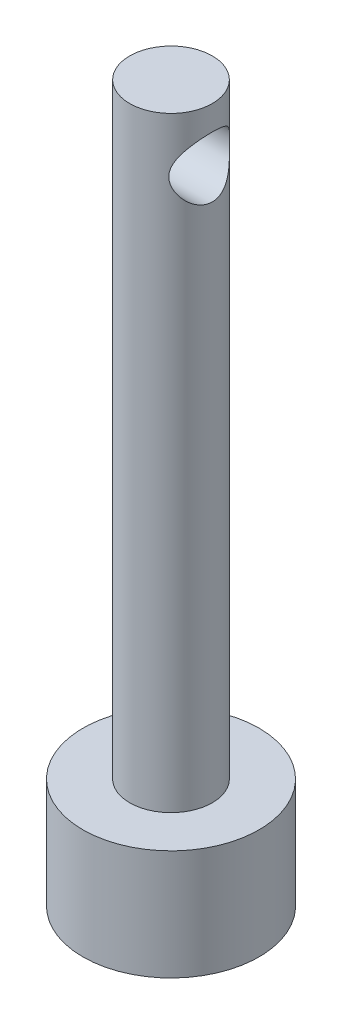
ISO-10303-21;
HEADER;
FILE_DESCRIPTION(('STEP AP214'),'2;1');
FILE_NAME('part.step','',(''),(''),'','','');
FILE_SCHEMA(('AUTOMOTIVE_DESIGN { 1 0 10303 214 1 1 1 1 }'));
ENDSEC;
DATA;
#1=APPLICATION_CONTEXT('core data for automotive mechanical design processes');
#2=APPLICATION_PROTOCOL_DEFINITION('international standard','automotive_design',2000,#1);
#3=PRODUCT_CONTEXT('',#1,'mechanical');
#4=PRODUCT('Part','Part','',(#3));
#5=PRODUCT_RELATED_PRODUCT_CATEGORY('part','',(#4));
#6=PRODUCT_DEFINITION_FORMATION('','',#4);
#7=PRODUCT_DEFINITION_CONTEXT('part definition',#1,'design');
#8=PRODUCT_DEFINITION('design','',#6,#7);
#9=PRODUCT_DEFINITION_SHAPE('','',#8);
#10=(LENGTH_UNIT() NAMED_UNIT(*) SI_UNIT(.MILLI.,.METRE.));
#11=(NAMED_UNIT(*) PLANE_ANGLE_UNIT() SI_UNIT($,.RADIAN.));
#12=(NAMED_UNIT(*) SI_UNIT($,.STERADIAN.) SOLID_ANGLE_UNIT());
#13=UNCERTAINTY_MEASURE_WITH_UNIT(LENGTH_MEASURE(1.E-05),#10,'distance_accuracy_value','');
#14=(GEOMETRIC_REPRESENTATION_CONTEXT(3) GLOBAL_UNCERTAINTY_ASSIGNED_CONTEXT((#13)) GLOBAL_UNIT_ASSIGNED_CONTEXT((#10,
#11,#12)) REPRESENTATION_CONTEXT('',''));
#15=CARTESIAN_POINT('',(0.,0.,0.));
#16=DIRECTION('',(0.,0.,1.));
#17=DIRECTION('',(1.,0.,0.));
#18=AXIS2_PLACEMENT_3D('',#15,#16,#17);
#19=CARTESIAN_POINT('',(0.,2.,0.));
#20=DIRECTION('',(0.,-1.,0.));
#21=DIRECTION('',(0.,0.,-1.));
#22=AXIS2_PLACEMENT_3D('',#19,#20,#21);
#23=CYLINDRICAL_SURFACE('',#22,1.6);
#24=CARTESIAN_POINT('',(0.,2.,0.));
#25=DIRECTION('',(0.,1.,0.));
#26=DIRECTION('',(0.,0.,1.));
#27=AXIS2_PLACEMENT_3D('',#24,#25,#26);
#28=CIRCLE('',#27,1.6);
#29=CARTESIAN_POINT('',(0.,2.,1.6));
#30=VERTEX_POINT('',#29);
#31=EDGE_CURVE('E54',#30,#30,#28,.T.);
#32=ORIENTED_EDGE('',*,*,#31,.F.);
#33=EDGE_LOOP('',(#32));
#34=FACE_BOUND('',#33,.T.);
#35=CARTESIAN_POINT('',(0.,0.,0.));
#36=DIRECTION('',(0.,1.,0.));
#37=DIRECTION('',(0.,0.,1.));
#38=AXIS2_PLACEMENT_3D('',#35,#36,#37);
#39=CIRCLE('',#38,1.6);
#40=CARTESIAN_POINT('',(0.,0.,1.6));
#41=VERTEX_POINT('',#40);
#42=EDGE_CURVE('E60',#41,#41,#39,.T.);
#43=ORIENTED_EDGE('',*,*,#42,.T.);
#44=EDGE_LOOP('',(#43));
#45=FACE_BOUND('',#44,.T.);
#46=ADVANCED_FACE('F41',(#34,#45),#23,.T.);
#47=CARTESIAN_POINT('',(0.,2.,0.));
#48=DIRECTION('',(0.,1.,0.));
#49=DIRECTION('',(0.,0.,1.));
#50=AXIS2_PLACEMENT_3D('',#47,#48,#49);
#51=PLANE('',#50);
#52=CARTESIAN_POINT('',(0.,2.,0.));
#53=DIRECTION('',(0.,1.,0.));
#54=DIRECTION('',(0.,0.,1.));
#55=AXIS2_PLACEMENT_3D('',#52,#53,#54);
#56=CIRCLE('',#55,0.75);
#57=CARTESIAN_POINT('',(0.,2.,0.75));
#58=VERTEX_POINT('',#57);
#59=EDGE_CURVE('E10',#58,#58,#56,.T.);
#60=ORIENTED_EDGE('',*,*,#59,.F.);
#61=EDGE_LOOP('',(#60));
#62=FACE_BOUND('',#61,.T.);
#63=ORIENTED_EDGE('',*,*,#31,.T.);
#64=EDGE_LOOP('',(#63));
#65=FACE_BOUND('',#64,.T.);
#66=ADVANCED_FACE('F92',(#62,#65),#51,.T.);
#67=CARTESIAN_POINT('',(0.,0.,0.));
#68=DIRECTION('',(0.,1.,0.));
#69=DIRECTION('',(0.,0.,1.));
#70=AXIS2_PLACEMENT_3D('',#67,#68,#69);
#71=PLANE('',#70);
#72=ORIENTED_EDGE('',*,*,#42,.F.);
#73=EDGE_LOOP('',(#72));
#74=FACE_BOUND('',#73,.T.);
#75=ADVANCED_FACE('F88',(#74),#71,.F.);
#76=CARTESIAN_POINT('',(0.,13.,0.));
#77=DIRECTION('',(0.,-1.,0.));
#78=DIRECTION('',(0.,0.,-1.));
#79=AXIS2_PLACEMENT_3D('',#76,#77,#78);
#80=CYLINDRICAL_SURFACE('',#79,0.75);
#81=CARTESIAN_POINT('',(-0.509901951359279,12.0025058729216,-0.55));
#82=CARTESIAN_POINT('',(-0.509908597788474,12.0284097461693,-0.549996666167638));
#83=CARTESIAN_POINT('',(-0.511922117120501,12.0543449784644,-0.548147960587643));
#84=CARTESIAN_POINT('',(-0.519524219763095,12.1052034800018,-0.540942685607774));
#85=CARTESIAN_POINT('',(-0.525123608163299,12.1301234477972,-0.535575513056823));
#86=CARTESIAN_POINT('',(-0.538772236168795,12.1779962160436,-0.521839104428009));
#87=CARTESIAN_POINT('',(-0.546788883921202,12.2009702750918,-0.513509557094741));
#88=CARTESIAN_POINT('',(-0.564315761366288,12.2451236997084,-0.494184080484322));
#89=CARTESIAN_POINT('',(-0.573825887837435,12.2663031891526,-0.483188335452427));
#90=CARTESIAN_POINT('',(-0.595496691635706,12.3108341760901,-0.456329698446503));
#91=CARTESIAN_POINT('',(-0.607810224607567,12.333790342528,-0.439934603599788));
#92=CARTESIAN_POINT('',(-0.63239185661236,12.3769842506053,-0.403806354466319));
#93=CARTESIAN_POINT('',(-0.644659868621981,12.3972181665165,-0.384068588682886));
#94=CARTESIAN_POINT('',(-0.670501986158419,12.4382503725643,-0.337298793066802));
#95=CARTESIAN_POINT('',(-0.683878200228059,12.4584187159779,-0.309593598201224));
#96=CARTESIAN_POINT('',(-0.707823336080307,12.4936057912333,-0.250019536371744));
#97=CARTESIAN_POINT('',(-0.7183984850247,12.5086359679534,-0.218160144323208));
#98=CARTESIAN_POINT('',(-0.732941935803762,12.5290401142368,-0.160930877029873));
#99=CARTESIAN_POINT('',(-0.737937126156791,12.535950889301,-0.136365431929978));
#100=CARTESIAN_POINT('',(-0.745466118874466,12.5463190367258,-0.0861538168406161));
#101=CARTESIAN_POINT('',(-0.748002008332248,12.5497793374125,-0.0605085825396615));
#102=CARTESIAN_POINT('',(-0.750395994587677,12.5530468623017,-0.00879819070268719));
#103=CARTESIAN_POINT('',(-0.750247742911875,12.552845425837,0.0172678166576493));
#104=CARTESIAN_POINT('',(-0.747271861447772,12.548781551251,0.0689588308943913));
#105=CARTESIAN_POINT('',(-0.744443559377022,12.5449181945482,0.0945837254768296));
#106=CARTESIAN_POINT('',(-0.736477269826313,12.5339308412528,0.143899046988462));
#107=CARTESIAN_POINT('',(-0.731411947286981,12.526909308456,0.167624575345831));
#108=CARTESIAN_POINT('',(-0.719364271896172,12.5099704706761,0.213490055898004));
#109=CARTESIAN_POINT('',(-0.712381521689854,12.5000525654411,0.235629678239897));
#110=CARTESIAN_POINT('',(-0.696083770090714,12.4764401816705,0.280346758742647));
#111=CARTESIAN_POINT('',(-0.686596690300478,12.462450242563,0.302704366609508));
#112=CARTESIAN_POINT('',(-0.666419010913556,12.4317473599785,0.344866875924002));
#113=CARTESIAN_POINT('',(-0.655727286200406,12.4150318642567,0.364669353278323));
#114=CARTESIAN_POINT('',(-0.631683451863538,12.3757497925662,0.405129455433461));
#115=CARTESIAN_POINT('',(-0.618213851084668,12.3526756846993,0.425225188816446));
#116=CARTESIAN_POINT('',(-0.591674964436321,12.3033590611679,0.461436558196914));
#117=CARTESIAN_POINT('',(-0.578605772249579,12.277115811017,0.477551268899179));
#118=CARTESIAN_POINT('',(-0.556984614684918,12.2274901426018,0.502473983368431));
#119=CARTESIAN_POINT('',(-0.548062959932376,12.2046853686049,0.51210701133705));
#120=CARTESIAN_POINT('',(-0.532421172072639,12.1573221367741,0.528351560595434));
#121=CARTESIAN_POINT('',(-0.525696089108358,12.1327677759169,0.534969888828639));
#122=CARTESIAN_POINT('',(-0.516396493374129,12.0866630385196,0.543938936545918));
#123=CARTESIAN_POINT('',(-0.513306229304985,12.06532479554,0.546828763955971));
#124=CARTESIAN_POINT('',(-0.509833877660226,12.0222440930481,0.550068824815726));
#125=CARTESIAN_POINT('',(-0.50944919299252,12.0005020412639,0.550421493697369));
#126=CARTESIAN_POINT('',(-0.511447665909897,11.9572826424202,0.548564222425318));
#127=CARTESIAN_POINT('',(-0.513828434391904,11.9358050830526,0.546356494227284));
#128=CARTESIAN_POINT('',(-0.52097869941253,11.8936338545928,0.539541380155421));
#129=CARTESIAN_POINT('',(-0.525751981852762,11.8729414839803,0.534930190594105));
#130=CARTESIAN_POINT('',(-0.539343459097979,11.8246808346398,0.521280575491773));
#131=CARTESIAN_POINT('',(-0.549015295770461,11.7976488168164,0.511210927537083));
#132=CARTESIAN_POINT('',(-0.570266149616088,11.7460702169793,0.487392620557116));
#133=CARTESIAN_POINT('',(-0.581848991290986,11.7215287817687,0.473636548693705));
#134=CARTESIAN_POINT('',(-0.606053242604221,11.6742933079032,0.442272120893556));
#135=CARTESIAN_POINT('',(-0.618695899723023,11.6516820965222,0.42455581869116));
#136=CARTESIAN_POINT('',(-0.643620224101247,11.609392827157,0.385726851603319));
#137=CARTESIAN_POINT('',(-0.655902161972226,11.5897125228186,0.364616813876704));
#138=CARTESIAN_POINT('',(-0.678900193544666,11.5540806165761,0.319709938042595));
#139=CARTESIAN_POINT('',(-0.689648294119107,11.5380465436525,0.295995597561765));
#140=CARTESIAN_POINT('',(-0.709121498503029,11.509595402883,0.24570825872634));
#141=CARTESIAN_POINT('',(-0.717847041828636,11.4971775490563,0.219135883284053));
#142=CARTESIAN_POINT('',(-0.73255554467388,11.4764915434596,0.163398267060823));
#143=CARTESIAN_POINT('',(-0.738514008760904,11.468260395568,0.134212498374434));
#144=CARTESIAN_POINT('',(-0.746908511719958,11.4567142848086,0.0744018470534607));
#145=CARTESIAN_POINT('',(-0.749348869739642,11.4533932936566,0.043778776780049));
#146=CARTESIAN_POINT('',(-0.750342954560393,11.4520386381801,-0.0130435248353205));
#147=CARTESIAN_POINT('',(-0.749423129675069,11.4532888256951,-0.039219777414013));
#148=CARTESIAN_POINT('',(-0.744922408311788,11.4594461297317,-0.090900986213336));
#149=CARTESIAN_POINT('',(-0.741341463584579,11.4643533125589,-0.116405930253666));
#150=CARTESIAN_POINT('',(-0.731962757889632,11.4773497496422,-0.165330001137448));
#151=CARTESIAN_POINT('',(-0.726232083928107,11.4853429003583,-0.188788113724238));
#152=CARTESIAN_POINT('',(-0.71295753851797,11.5041557882751,-0.233980417324214));
#153=CARTESIAN_POINT('',(-0.70541337790207,11.5149759762816,-0.255714332671823));
#154=CARTESIAN_POINT('',(-0.687904242221954,11.5406489198119,-0.29987029426098));
#155=CARTESIAN_POINT('',(-0.677752518351478,11.5558418338046,-0.322019371836216));
#156=CARTESIAN_POINT('',(-0.656386635719971,11.5889796525427,-0.363599122847782));
#157=CARTESIAN_POINT('',(-0.645171141862674,11.6069280335116,-0.383026302357708));
#158=CARTESIAN_POINT('',(-0.620187381171797,11.6489896905749,-0.422507254806817));
#159=CARTESIAN_POINT('',(-0.606343886472392,11.6736243643745,-0.44195951190496));
#160=CARTESIAN_POINT('',(-0.579521002091793,11.7261803645181,-0.476585243298218));
#161=CARTESIAN_POINT('',(-0.566541235286708,11.7541002415276,-0.491760594479772));
#162=CARTESIAN_POINT('',(-0.546573711569487,11.804722051604,-0.513723494207807));
#163=CARTESIAN_POINT('',(-0.538930214517975,11.8266609851794,-0.5216693419419));
#164=CARTESIAN_POINT('',(-0.525904410849085,11.8719640674852,-0.534799878884368));
#165=CARTESIAN_POINT('',(-0.520515146648909,11.8953235721589,-0.539993077474006));
#166=CARTESIAN_POINT('',(-0.514462723005578,11.9328303329935,-0.54574457948412));
#167=CARTESIAN_POINT('',(-0.512764220275517,11.9466592064383,-0.547334977731547));
#168=CARTESIAN_POINT('',(-0.510481971823191,11.9744909389414,-0.549463651032054));
#169=CARTESIAN_POINT('',(-0.509898356139006,11.9884938181037,-0.550001803353552));
#170=CARTESIAN_POINT('',(-0.509901951359279,12.0025058729216,-0.55));
#171=B_SPLINE_CURVE_WITH_KNOTS('',3,(#81,#82,#83,#84,#85,#86,#87,#88,#89,#90,#91,#92,#93,#94,
#95,#96,#97,#98,#99,#100,#101,#102,#103,#104,#105,#106,#107,#108,#109,#110,#111,#112,#113,#114,
#115,#116,#117,#118,#119,#120,#121,#122,#123,#124,#125,#126,#127,#128,#129,#130,#131,#132,#133,
#134,#135,#136,#137,#138,#139,#140,#141,#142,#143,#144,#145,#146,#147,#148,#149,#150,#151,#152,
#153,#154,#155,#156,#157,#158,#159,#160,#161,#162,#163,#164,#165,#166,#167,#168,#169,#170),
.UNSPECIFIED.,.T.,.F.,(4,2,2,2,2,2,2,2,2,2,2,2,2,2,2,2,2,2,2,2,2,2,2,2,2,2,2,2,2,2,2,2,2,2,2,2,
2,2,2,2,2,2,2,2,4),(0.,0.0776400316193908,0.155515119281495,0.232383908048304,0.309247386377927,
0.40126867148799,0.49341795760623,0.603162466937604,0.712660911148303,0.79034083444946,
0.867954776610316,0.945752313544695,1.02356937092097,1.09902591072324,1.17449809944892,
1.25827431944516,1.34212944387253,1.44203597861679,1.54196571248747,1.62065406133176,
1.69916384678194,1.76413536024838,1.82904449888248,1.89389760353171,1.95885365692117,
2.04962913430464,2.14058853513949,2.23442073921196,2.32818065259451,2.41954327752822,
2.51088603005969,2.60302266031934,2.69504607864229,2.77331375773678,2.85158285595156,
2.92758900280303,3.00360727716993,3.08943288963983,3.17536768093357,3.27787294123982,
3.38033314762666,3.45376227363062,3.5269630612839,3.56895560430271,3.61095304494448),.UNSPECIFIED.);
#172=CARTESIAN_POINT('',(-0.509901951359279,12.0025058729216,-0.55));
#173=VERTEX_POINT('',#172);
#174=EDGE_CURVE('E44',#173,#173,#171,.T.);
#175=ORIENTED_EDGE('',*,*,#174,.T.);
#176=EDGE_LOOP('',(#175));
#177=FACE_BOUND('',#176,.T.);
#178=CARTESIAN_POINT('',(0.509901951359279,12.0025058729216,-0.55));
#179=CARTESIAN_POINT('',(0.509908597788474,11.9766019996739,-0.549996666167638));
#180=CARTESIAN_POINT('',(0.511922117120501,11.9506667673787,-0.548147960587643));
#181=CARTESIAN_POINT('',(0.519524219763095,11.8998082658413,-0.540942685607774));
#182=CARTESIAN_POINT('',(0.525123608163299,11.874888298046,-0.535575513056823));
#183=CARTESIAN_POINT('',(0.538772236168795,11.8270155297996,-0.521839104428009));
#184=CARTESIAN_POINT('',(0.546788883921202,11.8040414707513,-0.513509557094741));
#185=CARTESIAN_POINT('',(0.564315761366288,11.7598880461347,-0.494184080484322));
#186=CARTESIAN_POINT('',(0.573825887837435,11.7387085566905,-0.483188335452427));
#187=CARTESIAN_POINT('',(0.595496691635706,11.694177569753,-0.456329698446503));
#188=CARTESIAN_POINT('',(0.607810224607567,11.6712214033151,-0.439934603599788));
#189=CARTESIAN_POINT('',(0.63239185661236,11.6280274952378,-0.403806354466319));
#190=CARTESIAN_POINT('',(0.644659868621981,11.6077935793267,-0.384068588682886));
#191=CARTESIAN_POINT('',(0.670501986158419,11.5667613732788,-0.337298793066802));
#192=CARTESIAN_POINT('',(0.683878200228059,11.5465930298652,-0.309593598201224));
#193=CARTESIAN_POINT('',(0.707823336080307,11.5114059546098,-0.250019536371745));
#194=CARTESIAN_POINT('',(0.7183984850247,11.4963757778897,-0.218160144323209));
#195=CARTESIAN_POINT('',(0.732941935803762,11.4759716316064,-0.160930877029873));
#196=CARTESIAN_POINT('',(0.737937126156791,11.4690608565421,-0.136365431929978));
#197=CARTESIAN_POINT('',(0.745466118874466,11.4586927091173,-0.0861538168406161));
#198=CARTESIAN_POINT('',(0.748002008332248,11.4552324084306,-0.0605085825396615));
#199=CARTESIAN_POINT('',(0.750395994587677,11.4519648835414,-0.00879819070268719));
#200=CARTESIAN_POINT('',(0.750247742911875,11.4521663200062,0.0172678166576493));
#201=CARTESIAN_POINT('',(0.747271861447772,11.4562301945921,0.0689588308943913));
#202=CARTESIAN_POINT('',(0.744443559377022,11.4600935512949,0.0945837254768297));
#203=CARTESIAN_POINT('',(0.736477269826313,11.4710809045903,0.143899046988462));
#204=CARTESIAN_POINT('',(0.731411947286981,11.4781024373871,0.16762457534583));
#205=CARTESIAN_POINT('',(0.719364271896172,11.495041275167,0.213490055898004));
#206=CARTESIAN_POINT('',(0.712381521689854,11.504959180402,0.235629678239897));
#207=CARTESIAN_POINT('',(0.696083770090714,11.5285715641726,0.280346758742648));
#208=CARTESIAN_POINT('',(0.686596690300478,11.5425615032801,0.302704366609508));
#209=CARTESIAN_POINT('',(0.666419010913556,11.5732643858646,0.344866875924002));
#210=CARTESIAN_POINT('',(0.655727286200406,11.5899798815865,0.364669353278323));
#211=CARTESIAN_POINT('',(0.631683451863537,11.6292619532769,0.405129455433461));
#212=CARTESIAN_POINT('',(0.618213851084668,11.6523360611439,0.425225188816446));
#213=CARTESIAN_POINT('',(0.591674964436321,11.7016526846753,0.461436558196914));
#214=CARTESIAN_POINT('',(0.578605772249579,11.7278959348261,0.477551268899179));
#215=CARTESIAN_POINT('',(0.556984614684918,11.7775216032413,0.502473983368431));
#216=CARTESIAN_POINT('',(0.548062959932376,11.8003263772382,0.51210701133705));
#217=CARTESIAN_POINT('',(0.532421172072639,11.847689609069,0.528351560595434));
#218=CARTESIAN_POINT('',(0.525696089108358,11.8722439699262,0.534969888828639));
#219=CARTESIAN_POINT('',(0.516396493374129,11.9183487073235,0.543938936545918));
#220=CARTESIAN_POINT('',(0.513306229304985,11.9396869503031,0.546828763955971));
#221=CARTESIAN_POINT('',(0.509833877660226,11.982767652795,0.550068824815726));
#222=CARTESIAN_POINT('',(0.50944919299252,12.0045097045792,0.550421493697369));
#223=CARTESIAN_POINT('',(0.511447665909897,12.0477291034229,0.548564222425318));
#224=CARTESIAN_POINT('',(0.513828434391904,12.0692066627906,0.546356494227284));
#225=CARTESIAN_POINT('',(0.520978699412529,12.1113778912503,0.539541380155421));
#226=CARTESIAN_POINT('',(0.525751981852762,12.1320702618629,0.534930190594106));
#227=CARTESIAN_POINT('',(0.539343459097979,12.1803309112033,0.521280575491773));
#228=CARTESIAN_POINT('',(0.549015295770461,12.2073629290267,0.511210927537083));
#229=CARTESIAN_POINT('',(0.570266149616088,12.2589415288638,0.487392620557116));
#230=CARTESIAN_POINT('',(0.581848991290986,12.2834829640744,0.473636548693705));
#231=CARTESIAN_POINT('',(0.606053242604221,12.33071843794,0.442272120893556));
#232=CARTESIAN_POINT('',(0.618695899723023,12.3533296493209,0.42455581869116));
#233=CARTESIAN_POINT('',(0.643620224101247,12.3956189186861,0.385726851603319));
#234=CARTESIAN_POINT('',(0.655902161972226,12.4152992230245,0.364616813876704));
#235=CARTESIAN_POINT('',(0.678900193544666,12.450931129267,0.319709938042596));
#236=CARTESIAN_POINT('',(0.689648294119107,12.4669652021906,0.295995597561766));
#237=CARTESIAN_POINT('',(0.709121498503029,12.4954163429601,0.24570825872634));
#238=CARTESIAN_POINT('',(0.717847041828636,12.5078341967869,0.219135883284054));
#239=CARTESIAN_POINT('',(0.73255554467388,12.5285202023835,0.163398267060823));
#240=CARTESIAN_POINT('',(0.738514008760904,12.5367513502752,0.134212498374434));
#241=CARTESIAN_POINT('',(0.746908511719958,12.5482974610345,0.0744018470534607));
#242=CARTESIAN_POINT('',(0.749348869739642,12.5516184521866,0.043778776780049));
#243=CARTESIAN_POINT('',(0.750342954560393,12.552973107663,-0.0130435248353205));
#244=CARTESIAN_POINT('',(0.749423129675069,12.551722920148,-0.0392197774140131));
#245=CARTESIAN_POINT('',(0.744922408311788,12.5455656161114,-0.0909009862133361));
#246=CARTESIAN_POINT('',(0.741341463584579,12.5406584332842,-0.116405930253666));
#247=CARTESIAN_POINT('',(0.731962757889632,12.5276619962009,-0.165330001137448));
#248=CARTESIAN_POINT('',(0.726232083928107,12.5196688454848,-0.188788113724238));
#249=CARTESIAN_POINT('',(0.71295753851797,12.500855957568,-0.233980417324214));
#250=CARTESIAN_POINT('',(0.70541337790207,12.4900357695615,-0.255714332671823));
#251=CARTESIAN_POINT('',(0.687904242221954,12.4643628260312,-0.29987029426098));
#252=CARTESIAN_POINT('',(0.677752518351478,12.4491699120385,-0.322019371836217));
#253=CARTESIAN_POINT('',(0.656386635719971,12.4160320933005,-0.363599122847783));
#254=CARTESIAN_POINT('',(0.645171141862674,12.3980837123315,-0.383026302357708));
#255=CARTESIAN_POINT('',(0.620187381171797,12.3560220552682,-0.422507254806817));
#256=CARTESIAN_POINT('',(0.606343886472392,12.3313873814686,-0.44195951190496));
#257=CARTESIAN_POINT('',(0.579521002091793,12.278831381325,-0.476585243298218));
#258=CARTESIAN_POINT('',(0.566541235286708,12.2509115043155,-0.491760594479772));
#259=CARTESIAN_POINT('',(0.546573711569488,12.2002896942391,-0.513723494207807));
#260=CARTESIAN_POINT('',(0.538930214517976,12.1783507606638,-0.5216693419419));
#261=CARTESIAN_POINT('',(0.525904410849085,12.1330476783579,-0.534799878884367));
#262=CARTESIAN_POINT('',(0.520515146648909,12.1096881736842,-0.539993077474005));
#263=CARTESIAN_POINT('',(0.514462723005578,12.0721814128496,-0.545744579484119));
#264=CARTESIAN_POINT('',(0.512764220275517,12.0583525394048,-0.547334977731547));
#265=CARTESIAN_POINT('',(0.510481971823191,12.0305208069017,-0.549463651032054));
#266=CARTESIAN_POINT('',(0.509898356139006,12.0165179277394,-0.550001803353552));
#267=CARTESIAN_POINT('',(0.509901951359279,12.0025058729216,-0.55));
#268=B_SPLINE_CURVE_WITH_KNOTS('',3,(#178,#179,#180,#181,#182,#183,#184,#185,#186,#187,#188,
#189,#190,#191,#192,#193,#194,#195,#196,#197,#198,#199,#200,#201,#202,#203,#204,#205,#206,#207,
#208,#209,#210,#211,#212,#213,#214,#215,#216,#217,#218,#219,#220,#221,#222,#223,#224,#225,#226,
#227,#228,#229,#230,#231,#232,#233,#234,#235,#236,#237,#238,#239,#240,#241,#242,#243,#244,#245,
#246,#247,#248,#249,#250,#251,#252,#253,#254,#255,#256,#257,#258,#259,#260,#261,#262,#263,#264,
#265,#266,#267),.UNSPECIFIED.,.T.,.F.,(4,2,2,2,2,2,2,2,2,2,2,2,2,2,2,2,2,2,2,2,2,2,2,2,2,2,2,2,
2,2,2,2,2,2,2,2,2,2,2,2,2,2,2,2,4),(0.,0.0776400316193908,0.155515119281495,0.232383908048304,
0.309247386377927,0.40126867148799,0.49341795760623,0.603162466937603,0.712660911148303,
0.79034083444946,0.867954776610316,0.945752313544695,1.02356937092097,1.09902591072324,
1.17449809944892,1.25827431944516,1.34212944387253,1.44203597861679,1.54196571248747,
1.62065406133176,1.69916384678194,1.76413536024838,1.82904449888248,1.89389760353171,
1.95885365692117,2.04962913430464,2.14058853513949,2.23442073921196,2.32818065259451,
2.41954327752822,2.51088603005969,2.60302266031934,2.69504607864229,2.77331375773678,
2.85158285595156,2.92758900280303,3.00360727716993,3.08943288963983,3.17536768093357,
3.27787294123982,3.38033314762666,3.45376227363062,3.5269630612839,3.56895560430271,
3.61095304494448),.UNSPECIFIED.);
#269=CARTESIAN_POINT('',(0.509901951359279,12.0025058729216,-0.55));
#270=VERTEX_POINT('',#269);
#271=EDGE_CURVE('E67',#270,#270,#268,.T.);
#272=ORIENTED_EDGE('',*,*,#271,.T.);
#273=EDGE_LOOP('',(#272));
#274=FACE_BOUND('',#273,.T.);
#275=CARTESIAN_POINT('',(0.,13.,0.));
#276=DIRECTION('',(0.,1.,0.));
#277=DIRECTION('',(0.,0.,1.));
#278=AXIS2_PLACEMENT_3D('',#275,#276,#277);
#279=CIRCLE('',#278,0.75);
#280=CARTESIAN_POINT('',(0.,13.,0.75));
#281=VERTEX_POINT('',#280);
#282=EDGE_CURVE('E63',#281,#281,#279,.T.);
#283=ORIENTED_EDGE('',*,*,#282,.F.);
#284=EDGE_LOOP('',(#283));
#285=FACE_BOUND('',#284,.T.);
#286=ORIENTED_EDGE('',*,*,#59,.T.);
#287=EDGE_LOOP('',(#286));
#288=FACE_BOUND('',#287,.T.);
#289=ADVANCED_FACE('F73',(#177,#274,#285,#288),#80,.T.);
#290=CARTESIAN_POINT('',(0.,13.,0.));
#291=DIRECTION('',(0.,1.,0.));
#292=DIRECTION('',(0.,0.,1.));
#293=AXIS2_PLACEMENT_3D('',#290,#291,#292);
#294=PLANE('',#293);
#295=ORIENTED_EDGE('',*,*,#282,.T.);
#296=EDGE_LOOP('',(#295));
#297=FACE_BOUND('',#296,.T.);
#298=ADVANCED_FACE('F80',(#297),#294,.T.);
#299=CARTESIAN_POINT('',(-1.6,12.0025058729216,0.));
#300=DIRECTION('',(1.,0.,0.));
#301=DIRECTION('',(0.,0.,-1.));
#302=AXIS2_PLACEMENT_3D('',#299,#300,#301);
#303=CYLINDRICAL_SURFACE('',#302,0.55);
#304=ORIENTED_EDGE('',*,*,#271,.F.);
#305=EDGE_LOOP('',(#304));
#306=FACE_BOUND('',#305,.T.);
#307=ORIENTED_EDGE('',*,*,#174,.F.);
#308=EDGE_LOOP('',(#307));
#309=FACE_BOUND('',#308,.T.);
#310=ADVANCED_FACE('F77',(#306,#309),#303,.F.);
#311=CLOSED_SHELL('',(#46,#66,#75,#289,#298,#310));
#312=MANIFOLD_SOLID_BREP('B2',#311);
#313=ADVANCED_BREP_SHAPE_REPRESENTATION('',(#18,#312),#14);
#314=SHAPE_DEFINITION_REPRESENTATION(#9,#313);
ENDSEC;
END-ISO-10303-21;
